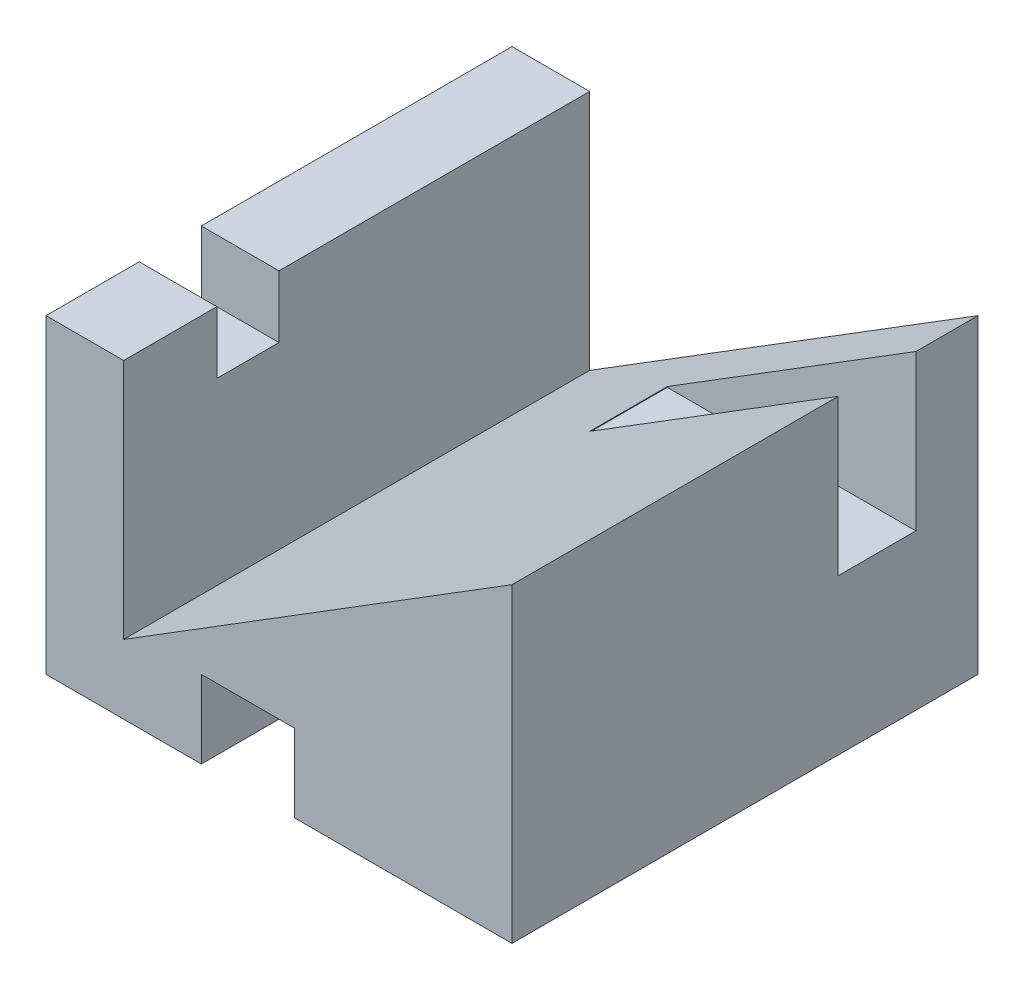
ISO-10303-21;
HEADER;
FILE_DESCRIPTION(('STEP AP214'),'2;1');
FILE_NAME('part.step','',(''),(''),'','','');
FILE_SCHEMA(('AUTOMOTIVE_DESIGN { 1 0 10303 214 1 1 1 1 }'));
ENDSEC;
DATA;
#1=APPLICATION_CONTEXT('core data for automotive mechanical design processes');
#2=APPLICATION_PROTOCOL_DEFINITION('international standard','automotive_design',2000,#1);
#3=PRODUCT_CONTEXT('',#1,'mechanical');
#4=PRODUCT('Part','Part','',(#3));
#5=PRODUCT_RELATED_PRODUCT_CATEGORY('part','',(#4));
#6=PRODUCT_DEFINITION_FORMATION('','',#4);
#7=PRODUCT_DEFINITION_CONTEXT('part definition',#1,'design');
#8=PRODUCT_DEFINITION('design','',#6,#7);
#9=PRODUCT_DEFINITION_SHAPE('','',#8);
#10=(LENGTH_UNIT() NAMED_UNIT(*) SI_UNIT(.MILLI.,.METRE.));
#11=(NAMED_UNIT(*) PLANE_ANGLE_UNIT() SI_UNIT($,.RADIAN.));
#12=(NAMED_UNIT(*) SI_UNIT($,.STERADIAN.) SOLID_ANGLE_UNIT());
#13=UNCERTAINTY_MEASURE_WITH_UNIT(LENGTH_MEASURE(1.E-05),#10,'distance_accuracy_value','');
#14=(GEOMETRIC_REPRESENTATION_CONTEXT(3) GLOBAL_UNCERTAINTY_ASSIGNED_CONTEXT((#13)) GLOBAL_UNIT_ASSIGNED_CONTEXT((#10,
#11,#12)) REPRESENTATION_CONTEXT('',''));
#15=CARTESIAN_POINT('',(0.,0.,0.));
#16=DIRECTION('',(0.,0.,1.));
#17=DIRECTION('',(1.,0.,0.));
#18=AXIS2_PLACEMENT_3D('',#15,#16,#17);
#19=CARTESIAN_POINT('',(-15.,10.,30.));
#20=DIRECTION('',(0.,-1.,0.));
#21=DIRECTION('',(0.,0.,-1.));
#22=AXIS2_PLACEMENT_3D('',#19,#20,#21);
#23=PLANE('',#22);
#24=DIRECTION('',(0.,0.,-1.));
#25=VECTOR('',#24,1.);
#26=CARTESIAN_POINT('',(-15.,10.,30.));
#27=LINE('',#26,#25);
#28=CARTESIAN_POINT('',(-15.,10.,20.));
#29=VERTEX_POINT('',#28);
#30=CARTESIAN_POINT('',(-15.,10.,0.));
#31=VERTEX_POINT('',#30);
#32=EDGE_CURVE('E278',#29,#31,#27,.T.);
#33=ORIENTED_EDGE('',*,*,#32,.F.);
#34=DIRECTION('',(-1.,0.,0.));
#35=VECTOR('',#34,1.);
#36=CARTESIAN_POINT('',(-15.,10.,20.));
#37=LINE('',#36,#35);
#38=CARTESIAN_POINT('',(-10.,10.,20.));
#39=VERTEX_POINT('',#38);
#40=EDGE_CURVE('E186',#39,#29,#37,.T.);
#41=ORIENTED_EDGE('',*,*,#40,.F.);
#42=DIRECTION('',(0.,0.,1.));
#43=VECTOR('',#42,1.);
#44=CARTESIAN_POINT('',(-10.,10.,0.));
#45=LINE('',#44,#43);
#46=CARTESIAN_POINT('',(-10.,10.,0.));
#47=VERTEX_POINT('',#46);
#48=EDGE_CURVE('E222',#47,#39,#45,.T.);
#49=ORIENTED_EDGE('',*,*,#48,.F.);
#50=DIRECTION('',(-1.,0.,0.));
#51=VECTOR('',#50,1.);
#52=CARTESIAN_POINT('',(-15.,10.,0.));
#53=LINE('',#52,#51);
#54=EDGE_CURVE('E265',#47,#31,#53,.T.);
#55=ORIENTED_EDGE('',*,*,#54,.T.);
#56=EDGE_LOOP('',(#33,#41,#49,#55));
#57=FACE_BOUND('',#56,.T.);
#58=ADVANCED_FACE('F33',(#57),#23,.F.);
#59=CARTESIAN_POINT('',(-15.,-10.,30.));
#60=DIRECTION('',(0.,1.,0.));
#61=DIRECTION('',(0.,0.,1.));
#62=AXIS2_PLACEMENT_3D('',#59,#60,#61);
#63=PLANE('',#62);
#64=DIRECTION('',(1.,0.,0.));
#65=VECTOR('',#64,1.);
#66=CARTESIAN_POINT('',(-15.,-10.,0.));
#67=LINE('',#66,#65);
#68=CARTESIAN_POINT('',(-15.,-10.,0.));
#69=VERTEX_POINT('',#68);
#70=CARTESIAN_POINT('',(-5.,-10.,0.));
#71=VERTEX_POINT('',#70);
#72=EDGE_CURVE('E255',#69,#71,#67,.T.);
#73=ORIENTED_EDGE('',*,*,#72,.T.);
#74=DIRECTION('',(0.,0.,1.));
#75=VECTOR('',#74,1.);
#76=CARTESIAN_POINT('',(-5.,-10.,0.));
#77=LINE('',#76,#75);
#78=CARTESIAN_POINT('',(-5.,-10.,30.));
#79=VERTEX_POINT('',#78);
#80=EDGE_CURVE('E235',#71,#79,#77,.T.);
#81=ORIENTED_EDGE('',*,*,#80,.T.);
#82=DIRECTION('',(1.,0.,0.));
#83=VECTOR('',#82,1.);
#84=CARTESIAN_POINT('',(-15.,-10.,30.));
#85=LINE('',#84,#83);
#86=CARTESIAN_POINT('',(-15.,-10.,30.));
#87=VERTEX_POINT('',#86);
#88=EDGE_CURVE('E260',#87,#79,#85,.T.);
#89=ORIENTED_EDGE('',*,*,#88,.F.);
#90=DIRECTION('',(0.,0.,-1.));
#91=VECTOR('',#90,1.);
#92=CARTESIAN_POINT('',(-15.,-10.,30.));
#93=LINE('',#92,#91);
#94=EDGE_CURVE('E275',#87,#69,#93,.T.);
#95=ORIENTED_EDGE('',*,*,#94,.T.);
#96=EDGE_LOOP('',(#73,#81,#89,#95));
#97=FACE_BOUND('',#96,.T.);
#98=ADVANCED_FACE('F331',(#97),#63,.F.);
#99=CARTESIAN_POINT('',(15.,10.,30.));
#100=DIRECTION('',(-1.,0.,0.));
#101=DIRECTION('',(0.,-1.,0.));
#102=AXIS2_PLACEMENT_3D('',#99,#100,#101);
#103=PLANE('',#102);
#104=DIRECTION('',(0.,0.,-1.));
#105=VECTOR('',#104,1.);
#106=CARTESIAN_POINT('',(15.,0.,4.));
#107=LINE('',#106,#105);
#108=CARTESIAN_POINT('',(15.,0.,9.));
#109=VERTEX_POINT('',#108);
#110=CARTESIAN_POINT('',(15.,0.,4.));
#111=VERTEX_POINT('',#110);
#112=EDGE_CURVE('E165',#109,#111,#107,.T.);
#113=ORIENTED_EDGE('',*,*,#112,.F.);
#114=DIRECTION('',(0.,1.,0.));
#115=VECTOR('',#114,1.);
#116=CARTESIAN_POINT('',(15.,0.,9.));
#117=LINE('',#116,#115);
#118=CARTESIAN_POINT('',(15.,10.,9.));
#119=VERTEX_POINT('',#118);
#120=EDGE_CURVE('E196',#109,#119,#117,.T.);
#121=ORIENTED_EDGE('',*,*,#120,.T.);
#122=DIRECTION('',(0.,0.,-1.));
#123=VECTOR('',#122,1.);
#124=CARTESIAN_POINT('',(15.,10.,30.));
#125=LINE('',#124,#123);
#126=CARTESIAN_POINT('',(15.,10.,30.));
#127=VERTEX_POINT('',#126);
#128=EDGE_CURVE('E282',#127,#119,#125,.T.);
#129=ORIENTED_EDGE('',*,*,#128,.F.);
#130=DIRECTION('',(0.,1.,0.));
#131=VECTOR('',#130,1.);
#132=CARTESIAN_POINT('',(15.,10.,30.));
#133=LINE('',#132,#131);
#134=CARTESIAN_POINT('',(15.,-10.,30.));
#135=VERTEX_POINT('',#134);
#136=EDGE_CURVE('E251',#135,#127,#133,.T.);
#137=ORIENTED_EDGE('',*,*,#136,.F.);
#138=DIRECTION('',(0.,0.,-1.));
#139=VECTOR('',#138,1.);
#140=CARTESIAN_POINT('',(15.,-10.,30.));
#141=LINE('',#140,#139);
#142=CARTESIAN_POINT('',(15.,-10.,0.));
#143=VERTEX_POINT('',#142);
#144=EDGE_CURVE('E263',#135,#143,#141,.T.);
#145=ORIENTED_EDGE('',*,*,#144,.T.);
#146=DIRECTION('',(0.,1.,0.));
#147=VECTOR('',#146,1.);
#148=CARTESIAN_POINT('',(15.,10.,0.));
#149=LINE('',#148,#147);
#150=CARTESIAN_POINT('',(15.,10.,0.));
#151=VERTEX_POINT('',#150);
#152=EDGE_CURVE('E244',#143,#151,#149,.T.);
#153=ORIENTED_EDGE('',*,*,#152,.T.);
#154=CARTESIAN_POINT('',(15.,10.,4.));
#155=VERTEX_POINT('',#154);
#156=EDGE_CURVE('E177',#155,#151,#125,.T.);
#157=ORIENTED_EDGE('',*,*,#156,.F.);
#158=DIRECTION('',(0.,1.,0.));
#159=VECTOR('',#158,1.);
#160=CARTESIAN_POINT('',(15.,0.,4.));
#161=LINE('',#160,#159);
#162=EDGE_CURVE('E48',#111,#155,#161,.T.);
#163=ORIENTED_EDGE('',*,*,#162,.F.);
#164=EDGE_LOOP('',(#113,#121,#129,#137,#145,#153,#157,#163));
#165=FACE_BOUND('',#164,.T.);
#166=ADVANCED_FACE('F35',(#165),#103,.F.);
#167=CARTESIAN_POINT('',(-10.,10.,24.));
#168=VERTEX_POINT('',#167);
#169=CARTESIAN_POINT('',(-10.,10.,30.));
#170=VERTEX_POINT('',#169);
#171=EDGE_CURVE('E215',#168,#170,#45,.T.);
#172=ORIENTED_EDGE('',*,*,#171,.F.);
#173=DIRECTION('',(1.,0.,0.));
#174=VECTOR('',#173,1.);
#175=CARTESIAN_POINT('',(-15.,10.,24.));
#176=LINE('',#175,#174);
#177=CARTESIAN_POINT('',(-15.,10.,24.));
#178=VERTEX_POINT('',#177);
#179=EDGE_CURVE('E194',#178,#168,#176,.T.);
#180=ORIENTED_EDGE('',*,*,#179,.F.);
#181=CARTESIAN_POINT('',(-15.,10.,30.));
#182=VERTEX_POINT('',#181);
#183=EDGE_CURVE('E279',#182,#178,#27,.T.);
#184=ORIENTED_EDGE('',*,*,#183,.F.);
#185=DIRECTION('',(-1.,0.,0.));
#186=VECTOR('',#185,1.);
#187=CARTESIAN_POINT('',(-15.,10.,30.));
#188=LINE('',#187,#186);
#189=EDGE_CURVE('E254',#170,#182,#188,.T.);
#190=ORIENTED_EDGE('',*,*,#189,.F.);
#191=EDGE_LOOP('',(#172,#180,#184,#190));
#192=FACE_BOUND('',#191,.T.);
#193=ADVANCED_FACE('F319',(#192),#23,.F.);
#194=CARTESIAN_POINT('',(-15.,10.,30.));
#195=DIRECTION('',(1.,0.,0.));
#196=DIRECTION('',(0.,1.,0.));
#197=AXIS2_PLACEMENT_3D('',#194,#195,#196);
#198=PLANE('',#197);
#199=DIRECTION('',(0.,0.,1.));
#200=VECTOR('',#199,1.);
#201=CARTESIAN_POINT('',(-15.,6.00000000000002,20.));
#202=LINE('',#201,#200);
#203=CARTESIAN_POINT('',(-15.,6.00000000000002,20.));
#204=VERTEX_POINT('',#203);
#205=CARTESIAN_POINT('',(-15.,6.00000000000002,24.));
#206=VERTEX_POINT('',#205);
#207=EDGE_CURVE('E184',#204,#206,#202,.T.);
#208=ORIENTED_EDGE('',*,*,#207,.F.);
#209=DIRECTION('',(0.,1.,0.));
#210=VECTOR('',#209,1.);
#211=CARTESIAN_POINT('',(-15.,6.00000000000002,20.));
#212=LINE('',#211,#210);
#213=EDGE_CURVE('E198',#204,#29,#212,.T.);
#214=ORIENTED_EDGE('',*,*,#213,.T.);
#215=ORIENTED_EDGE('',*,*,#32,.T.);
#216=DIRECTION('',(0.,-1.,0.));
#217=VECTOR('',#216,1.);
#218=CARTESIAN_POINT('',(-15.,10.,0.));
#219=LINE('',#218,#217);
#220=EDGE_CURVE('E268',#31,#69,#219,.T.);
#221=ORIENTED_EDGE('',*,*,#220,.T.);
#222=ORIENTED_EDGE('',*,*,#94,.F.);
#223=DIRECTION('',(0.,-1.,0.));
#224=VECTOR('',#223,1.);
#225=CARTESIAN_POINT('',(-15.,10.,30.));
#226=LINE('',#225,#224);
#227=EDGE_CURVE('E257',#182,#87,#226,.T.);
#228=ORIENTED_EDGE('',*,*,#227,.F.);
#229=ORIENTED_EDGE('',*,*,#183,.T.);
#230=DIRECTION('',(0.,1.,0.));
#231=VECTOR('',#230,1.);
#232=CARTESIAN_POINT('',(-15.,6.00000000000002,24.));
#233=LINE('',#232,#231);
#234=EDGE_CURVE('E193',#206,#178,#233,.T.);
#235=ORIENTED_EDGE('',*,*,#234,.F.);
#236=EDGE_LOOP('',(#208,#214,#215,#221,#222,#228,#229,#235));
#237=FACE_BOUND('',#236,.T.);
#238=ADVANCED_FACE('F326',(#237),#198,.F.);
#239=CARTESIAN_POINT('',(0.999999999999997,-10.,30.));
#240=VERTEX_POINT('',#239);
#241=EDGE_CURVE('E259',#240,#135,#85,.T.);
#242=ORIENTED_EDGE('',*,*,#241,.F.);
#243=DIRECTION('',(0.,0.,1.));
#244=VECTOR('',#243,1.);
#245=CARTESIAN_POINT('',(0.999999999999997,-10.,0.));
#246=LINE('',#245,#244);
#247=CARTESIAN_POINT('',(0.999999999999997,-10.,0.));
#248=VERTEX_POINT('',#247);
#249=EDGE_CURVE('E247',#248,#240,#246,.T.);
#250=ORIENTED_EDGE('',*,*,#249,.F.);
#251=EDGE_CURVE('E270',#248,#143,#67,.T.);
#252=ORIENTED_EDGE('',*,*,#251,.T.);
#253=ORIENTED_EDGE('',*,*,#144,.F.);
#254=EDGE_LOOP('',(#242,#250,#252,#253));
#255=FACE_BOUND('',#254,.T.);
#256=ADVANCED_FACE('F343',(#255),#63,.F.);
#257=CARTESIAN_POINT('',(0.,0.,30.));
#258=DIRECTION('',(0.,0.,1.));
#259=DIRECTION('',(1.,0.,0.));
#260=AXIS2_PLACEMENT_3D('',#257,#258,#259);
#261=PLANE('',#260);
#262=DIRECTION('',(0.849123028037868,0.52819511854598,0.));
#263=VECTOR('',#262,1.);
#264=CARTESIAN_POINT('',(-10.,-5.55119520685121,30.));
#265=LINE('',#264,#263);
#266=CARTESIAN_POINT('',(-10.,-5.55119520685121,30.));
#267=VERTEX_POINT('',#266);
#268=EDGE_CURVE('E212',#267,#127,#265,.T.);
#269=ORIENTED_EDGE('',*,*,#268,.F.);
#270=DIRECTION('',(0.,-1.,0.));
#271=VECTOR('',#270,1.);
#272=CARTESIAN_POINT('',(-10.,10.,30.));
#273=LINE('',#272,#271);
#274=EDGE_CURVE('E201',#170,#267,#273,.T.);
#275=ORIENTED_EDGE('',*,*,#274,.F.);
#276=ORIENTED_EDGE('',*,*,#189,.T.);
#277=ORIENTED_EDGE('',*,*,#227,.T.);
#278=ORIENTED_EDGE('',*,*,#88,.T.);
#279=DIRECTION('',(0.,-1.,0.));
#280=VECTOR('',#279,1.);
#281=CARTESIAN_POINT('',(-5.,-10.,30.));
#282=LINE('',#281,#280);
#283=CARTESIAN_POINT('',(-5.,-5.,30.));
#284=VERTEX_POINT('',#283);
#285=EDGE_CURVE('E221',#284,#79,#282,.T.);
#286=ORIENTED_EDGE('',*,*,#285,.F.);
#287=DIRECTION('',(-1.,0.,0.));
#288=VECTOR('',#287,1.);
#289=CARTESIAN_POINT('',(-5.,-5.,30.));
#290=LINE('',#289,#288);
#291=CARTESIAN_POINT('',(0.999999999999997,-5.,30.));
#292=VERTEX_POINT('',#291);
#293=EDGE_CURVE('E229',#292,#284,#290,.T.);
#294=ORIENTED_EDGE('',*,*,#293,.F.);
#295=DIRECTION('',(0.,1.,0.));
#296=VECTOR('',#295,1.);
#297=CARTESIAN_POINT('',(0.999999999999997,-10.,30.));
#298=LINE('',#297,#296);
#299=EDGE_CURVE('E237',#240,#292,#298,.T.);
#300=ORIENTED_EDGE('',*,*,#299,.F.);
#301=ORIENTED_EDGE('',*,*,#241,.T.);
#302=ORIENTED_EDGE('',*,*,#136,.T.);
#303=EDGE_LOOP('',(#269,#275,#276,#277,#278,#286,#294,#300,#301,#302));
#304=FACE_BOUND('',#303,.T.);
#305=ADVANCED_FACE('F302',(#304),#261,.T.);
#306=CARTESIAN_POINT('',(0.,0.,0.));
#307=DIRECTION('',(0.,0.,1.));
#308=DIRECTION('',(1.,0.,0.));
#309=AXIS2_PLACEMENT_3D('',#306,#307,#308);
#310=PLANE('',#309);
#311=DIRECTION('',(0.,-1.,0.));
#312=VECTOR('',#311,1.);
#313=CARTESIAN_POINT('',(-10.,10.,0.));
#314=LINE('',#313,#312);
#315=CARTESIAN_POINT('',(-10.,-5.55119520685121,0.));
#316=VERTEX_POINT('',#315);
#317=EDGE_CURVE('E208',#47,#316,#314,.T.);
#318=ORIENTED_EDGE('',*,*,#317,.T.);
#319=DIRECTION('',(0.849123028037868,0.52819511854598,0.));
#320=VECTOR('',#319,1.);
#321=CARTESIAN_POINT('',(-10.,-5.55119520685121,0.));
#322=LINE('',#321,#320);
#323=EDGE_CURVE('E211',#316,#151,#322,.T.);
#324=ORIENTED_EDGE('',*,*,#323,.T.);
#325=ORIENTED_EDGE('',*,*,#152,.F.);
#326=ORIENTED_EDGE('',*,*,#251,.F.);
#327=DIRECTION('',(0.,1.,0.));
#328=VECTOR('',#327,1.);
#329=CARTESIAN_POINT('',(0.999999999999997,-10.,0.));
#330=LINE('',#329,#328);
#331=CARTESIAN_POINT('',(0.999999999999997,-5.,0.));
#332=VERTEX_POINT('',#331);
#333=EDGE_CURVE('E228',#248,#332,#330,.T.);
#334=ORIENTED_EDGE('',*,*,#333,.T.);
#335=DIRECTION('',(-1.,0.,0.));
#336=VECTOR('',#335,1.);
#337=CARTESIAN_POINT('',(-5.,-5.,0.));
#338=LINE('',#337,#336);
#339=CARTESIAN_POINT('',(-5.,-5.,0.));
#340=VERTEX_POINT('',#339);
#341=EDGE_CURVE('E232',#332,#340,#338,.T.);
#342=ORIENTED_EDGE('',*,*,#341,.T.);
#343=DIRECTION('',(0.,-1.,0.));
#344=VECTOR('',#343,1.);
#345=CARTESIAN_POINT('',(-5.,-10.,0.));
#346=LINE('',#345,#344);
#347=EDGE_CURVE('E225',#340,#71,#346,.T.);
#348=ORIENTED_EDGE('',*,*,#347,.T.);
#349=ORIENTED_EDGE('',*,*,#72,.F.);
#350=ORIENTED_EDGE('',*,*,#220,.F.);
#351=ORIENTED_EDGE('',*,*,#54,.F.);
#352=EDGE_LOOP('',(#318,#324,#325,#326,#334,#342,#348,#349,#350,#351));
#353=FACE_BOUND('',#352,.T.);
#354=ADVANCED_FACE('F310',(#353),#310,.F.);
#355=CARTESIAN_POINT('',(-5.,-10.,0.));
#356=DIRECTION('',(-1.,0.,0.));
#357=DIRECTION('',(0.,0.,1.));
#358=AXIS2_PLACEMENT_3D('',#355,#356,#357);
#359=PLANE('',#358);
#360=ORIENTED_EDGE('',*,*,#285,.T.);
#361=ORIENTED_EDGE('',*,*,#80,.F.);
#362=ORIENTED_EDGE('',*,*,#347,.F.);
#363=DIRECTION('',(0.,0.,1.));
#364=VECTOR('',#363,1.);
#365=CARTESIAN_POINT('',(-5.,-5.,0.));
#366=LINE('',#365,#364);
#367=EDGE_CURVE('E242',#340,#284,#366,.T.);
#368=ORIENTED_EDGE('',*,*,#367,.T.);
#369=EDGE_LOOP('',(#360,#361,#362,#368));
#370=FACE_BOUND('',#369,.T.);
#371=ADVANCED_FACE('F335',(#370),#359,.F.);
#372=CARTESIAN_POINT('',(-5.,-5.,0.));
#373=DIRECTION('',(0.,1.,0.));
#374=DIRECTION('',(0.,0.,1.));
#375=AXIS2_PLACEMENT_3D('',#372,#373,#374);
#376=PLANE('',#375);
#377=ORIENTED_EDGE('',*,*,#293,.T.);
#378=ORIENTED_EDGE('',*,*,#367,.F.);
#379=ORIENTED_EDGE('',*,*,#341,.F.);
#380=DIRECTION('',(0.,0.,1.));
#381=VECTOR('',#380,1.);
#382=CARTESIAN_POINT('',(0.999999999999997,-5.,0.));
#383=LINE('',#382,#381);
#384=EDGE_CURVE('E245',#332,#292,#383,.T.);
#385=ORIENTED_EDGE('',*,*,#384,.T.);
#386=EDGE_LOOP('',(#377,#378,#379,#385));
#387=FACE_BOUND('',#386,.T.);
#388=ADVANCED_FACE('F339',(#387),#376,.F.);
#389=CARTESIAN_POINT('',(0.999999999999997,-10.,0.));
#390=DIRECTION('',(1.,0.,0.));
#391=DIRECTION('',(0.,0.,-1.));
#392=AXIS2_PLACEMENT_3D('',#389,#390,#391);
#393=PLANE('',#392);
#394=ORIENTED_EDGE('',*,*,#299,.T.);
#395=ORIENTED_EDGE('',*,*,#384,.F.);
#396=ORIENTED_EDGE('',*,*,#333,.F.);
#397=ORIENTED_EDGE('',*,*,#249,.T.);
#398=EDGE_LOOP('',(#394,#395,#396,#397));
#399=FACE_BOUND('',#398,.T.);
#400=ADVANCED_FACE('F341',(#399),#393,.F.);
#401=CARTESIAN_POINT('',(-10.,-5.55119520685121,0.));
#402=DIRECTION('',(0.52819511854598,-0.849123028037868,0.));
#403=DIRECTION('',(0.849123028037868,0.52819511854598,0.));
#404=AXIS2_PLACEMENT_3D('',#401,#402,#403);
#405=PLANE('',#404);
#406=ORIENTED_EDGE('',*,*,#128,.T.);
#407=DIRECTION('',(-0.849123028037868,-0.52819511854598,0.));
#408=VECTOR('',#407,1.);
#409=CARTESIAN_POINT('',(-10.,-5.55119520685121,9.));
#410=LINE('',#409,#408);
#411=CARTESIAN_POINT('',(-1.,0.0472350676152233,9.));
#412=VERTEX_POINT('',#411);
#413=EDGE_CURVE('E11',#119,#412,#410,.T.);
#414=ORIENTED_EDGE('',*,*,#413,.T.);
#415=DIRECTION('',(0.,0.,-1.));
#416=VECTOR('',#415,1.);
#417=CARTESIAN_POINT('',(-1.,0.047235067615223,0.));
#418=LINE('',#417,#416);
#419=CARTESIAN_POINT('',(-1.,0.0472350676152238,4.));
#420=VERTEX_POINT('',#419);
#421=EDGE_CURVE('E41',#412,#420,#418,.T.);
#422=ORIENTED_EDGE('',*,*,#421,.T.);
#423=DIRECTION('',(0.849123028037868,0.52819511854598,0.));
#424=VECTOR('',#423,1.);
#425=CARTESIAN_POINT('',(-10.,-5.55119520685121,4.));
#426=LINE('',#425,#424);
#427=EDGE_CURVE('E285',#420,#155,#426,.T.);
#428=ORIENTED_EDGE('',*,*,#427,.T.);
#429=ORIENTED_EDGE('',*,*,#156,.T.);
#430=ORIENTED_EDGE('',*,*,#323,.F.);
#431=DIRECTION('',(0.,0.,1.));
#432=VECTOR('',#431,1.);
#433=CARTESIAN_POINT('',(-10.,-5.55119520685121,0.));
#434=LINE('',#433,#432);
#435=EDGE_CURVE('E219',#316,#267,#434,.T.);
#436=ORIENTED_EDGE('',*,*,#435,.T.);
#437=ORIENTED_EDGE('',*,*,#268,.T.);
#438=EDGE_LOOP('',(#406,#414,#422,#428,#429,#430,#436,#437));
#439=FACE_BOUND('',#438,.T.);
#440=ADVANCED_FACE('F288',(#439),#405,.F.);
#441=CARTESIAN_POINT('',(-10.,10.,0.));
#442=DIRECTION('',(-1.,0.,0.));
#443=DIRECTION('',(0.,-1.,0.));
#444=AXIS2_PLACEMENT_3D('',#441,#442,#443);
#445=PLANE('',#444);
#446=ORIENTED_EDGE('',*,*,#48,.T.);
#447=DIRECTION('',(0.,1.,0.));
#448=VECTOR('',#447,1.);
#449=CARTESIAN_POINT('',(-10.,6.00000000000002,20.));
#450=LINE('',#449,#448);
#451=CARTESIAN_POINT('',(-10.,6.00000000000002,20.));
#452=VERTEX_POINT('',#451);
#453=EDGE_CURVE('E202',#452,#39,#450,.T.);
#454=ORIENTED_EDGE('',*,*,#453,.F.);
#455=DIRECTION('',(0.,0.,-1.));
#456=VECTOR('',#455,1.);
#457=CARTESIAN_POINT('',(-10.,6.00000000000002,20.));
#458=LINE('',#457,#456);
#459=CARTESIAN_POINT('',(-10.,6.00000000000002,24.));
#460=VERTEX_POINT('',#459);
#461=EDGE_CURVE('E188',#460,#452,#458,.T.);
#462=ORIENTED_EDGE('',*,*,#461,.F.);
#463=DIRECTION('',(0.,1.,0.));
#464=VECTOR('',#463,1.);
#465=CARTESIAN_POINT('',(-10.,6.00000000000002,24.));
#466=LINE('',#465,#464);
#467=EDGE_CURVE('E204',#460,#168,#466,.T.);
#468=ORIENTED_EDGE('',*,*,#467,.T.);
#469=ORIENTED_EDGE('',*,*,#171,.T.);
#470=ORIENTED_EDGE('',*,*,#274,.T.);
#471=ORIENTED_EDGE('',*,*,#435,.F.);
#472=ORIENTED_EDGE('',*,*,#317,.F.);
#473=EDGE_LOOP('',(#446,#454,#462,#468,#469,#470,#471,#472));
#474=FACE_BOUND('',#473,.T.);
#475=ADVANCED_FACE('F313',(#474),#445,.F.);
#476=CARTESIAN_POINT('',(-15.,6.00000000000002,20.));
#477=DIRECTION('',(0.,0.,-1.));
#478=DIRECTION('',(-1.,0.,0.));
#479=AXIS2_PLACEMENT_3D('',#476,#477,#478);
#480=PLANE('',#479);
#481=ORIENTED_EDGE('',*,*,#40,.T.);
#482=ORIENTED_EDGE('',*,*,#213,.F.);
#483=DIRECTION('',(-1.,0.,0.));
#484=VECTOR('',#483,1.);
#485=CARTESIAN_POINT('',(-15.,6.00000000000002,20.));
#486=LINE('',#485,#484);
#487=EDGE_CURVE('E190',#452,#204,#486,.T.);
#488=ORIENTED_EDGE('',*,*,#487,.F.);
#489=ORIENTED_EDGE('',*,*,#453,.T.);
#490=EDGE_LOOP('',(#481,#482,#488,#489));
#491=FACE_BOUND('',#490,.T.);
#492=ADVANCED_FACE('F438',(#491),#480,.F.);
#493=CARTESIAN_POINT('',(-15.,6.00000000000002,24.));
#494=DIRECTION('',(0.,0.,1.));
#495=DIRECTION('',(1.,0.,0.));
#496=AXIS2_PLACEMENT_3D('',#493,#494,#495);
#497=PLANE('',#496);
#498=ORIENTED_EDGE('',*,*,#179,.T.);
#499=ORIENTED_EDGE('',*,*,#467,.F.);
#500=DIRECTION('',(1.,0.,0.));
#501=VECTOR('',#500,1.);
#502=CARTESIAN_POINT('',(-15.,6.00000000000002,24.));
#503=LINE('',#502,#501);
#504=EDGE_CURVE('E56',#206,#460,#503,.T.);
#505=ORIENTED_EDGE('',*,*,#504,.F.);
#506=ORIENTED_EDGE('',*,*,#234,.T.);
#507=EDGE_LOOP('',(#498,#499,#505,#506));
#508=FACE_BOUND('',#507,.T.);
#509=ADVANCED_FACE('F446',(#508),#497,.F.);
#510=CARTESIAN_POINT('',(0.,6.00000000000002,0.));
#511=DIRECTION('',(0.,1.,0.));
#512=DIRECTION('',(0.,0.,1.));
#513=AXIS2_PLACEMENT_3D('',#510,#511,#512);
#514=PLANE('',#513);
#515=ORIENTED_EDGE('',*,*,#207,.T.);
#516=ORIENTED_EDGE('',*,*,#504,.T.);
#517=ORIENTED_EDGE('',*,*,#461,.T.);
#518=ORIENTED_EDGE('',*,*,#487,.T.);
#519=EDGE_LOOP('',(#515,#516,#517,#518));
#520=FACE_BOUND('',#519,.T.);
#521=ADVANCED_FACE('F455',(#520),#514,.T.);
#522=CARTESIAN_POINT('',(15.,0.,9.));
#523=DIRECTION('',(0.,0.,1.));
#524=DIRECTION('',(1.,0.,0.));
#525=AXIS2_PLACEMENT_3D('',#522,#523,#524);
#526=PLANE('',#525);
#527=ORIENTED_EDGE('',*,*,#120,.F.);
#528=DIRECTION('',(1.,0.,0.));
#529=VECTOR('',#528,1.);
#530=CARTESIAN_POINT('',(15.,0.,9.));
#531=LINE('',#530,#529);
#532=CARTESIAN_POINT('',(-1.,0.,9.));
#533=VERTEX_POINT('',#532);
#534=EDGE_CURVE('E171',#533,#109,#531,.T.);
#535=ORIENTED_EDGE('',*,*,#534,.F.);
#536=DIRECTION('',(0.,1.,0.));
#537=VECTOR('',#536,1.);
#538=CARTESIAN_POINT('',(-1.,0.,9.));
#539=LINE('',#538,#537);
#540=EDGE_CURVE('E179',#533,#412,#539,.T.);
#541=ORIENTED_EDGE('',*,*,#540,.T.);
#542=ORIENTED_EDGE('',*,*,#413,.F.);
#543=EDGE_LOOP('',(#527,#535,#541,#542));
#544=FACE_BOUND('',#543,.T.);
#545=ADVANCED_FACE('F293',(#544),#526,.F.);
#546=CARTESIAN_POINT('',(-1.,0.,4.));
#547=DIRECTION('',(-1.,0.,0.));
#548=DIRECTION('',(0.,0.,1.));
#549=AXIS2_PLACEMENT_3D('',#546,#547,#548);
#550=PLANE('',#549);
#551=ORIENTED_EDGE('',*,*,#540,.F.);
#552=DIRECTION('',(0.,0.,1.));
#553=VECTOR('',#552,1.);
#554=CARTESIAN_POINT('',(-1.,0.,4.));
#555=LINE('',#554,#553);
#556=CARTESIAN_POINT('',(-1.,0.,4.));
#557=VERTEX_POINT('',#556);
#558=EDGE_CURVE('E164',#557,#533,#555,.T.);
#559=ORIENTED_EDGE('',*,*,#558,.F.);
#560=DIRECTION('',(0.,1.,0.));
#561=VECTOR('',#560,1.);
#562=CARTESIAN_POINT('',(-1.,0.,4.));
#563=LINE('',#562,#561);
#564=EDGE_CURVE('E160',#557,#420,#563,.T.);
#565=ORIENTED_EDGE('',*,*,#564,.T.);
#566=ORIENTED_EDGE('',*,*,#421,.F.);
#567=EDGE_LOOP('',(#551,#559,#565,#566));
#568=FACE_BOUND('',#567,.T.);
#569=ADVANCED_FACE('F291',(#568),#550,.F.);
#570=CARTESIAN_POINT('',(15.,0.,4.));
#571=DIRECTION('',(0.,0.,-1.));
#572=DIRECTION('',(-1.,0.,0.));
#573=AXIS2_PLACEMENT_3D('',#570,#571,#572);
#574=PLANE('',#573);
#575=ORIENTED_EDGE('',*,*,#564,.F.);
#576=DIRECTION('',(-1.,0.,0.));
#577=VECTOR('',#576,1.);
#578=CARTESIAN_POINT('',(15.,0.,4.));
#579=LINE('',#578,#577);
#580=EDGE_CURVE('E156',#111,#557,#579,.T.);
#581=ORIENTED_EDGE('',*,*,#580,.F.);
#582=ORIENTED_EDGE('',*,*,#162,.T.);
#583=ORIENTED_EDGE('',*,*,#427,.F.);
#584=EDGE_LOOP('',(#575,#581,#582,#583));
#585=FACE_BOUND('',#584,.T.);
#586=ADVANCED_FACE('F158',(#585),#574,.F.);
#587=CARTESIAN_POINT('',(0.,0.,0.));
#588=DIRECTION('',(0.,-1.,0.));
#589=DIRECTION('',(0.,0.,-1.));
#590=AXIS2_PLACEMENT_3D('',#587,#588,#589);
#591=PLANE('',#590);
#592=ORIENTED_EDGE('',*,*,#112,.T.);
#593=ORIENTED_EDGE('',*,*,#580,.T.);
#594=ORIENTED_EDGE('',*,*,#558,.T.);
#595=ORIENTED_EDGE('',*,*,#534,.T.);
#596=EDGE_LOOP('',(#592,#593,#594,#595));
#597=FACE_BOUND('',#596,.T.);
#598=ADVANCED_FACE('F169',(#597),#591,.F.);
#599=CLOSED_SHELL('',(#58,#98,#166,#193,#238,#256,#305,#354,#371,#388,#400,#440,#475,#492,#509,
#521,#545,#569,#586,#598));
#600=MANIFOLD_SOLID_BREP('B2',#599);
#601=ADVANCED_BREP_SHAPE_REPRESENTATION('',(#18,#600),#14);
#602=SHAPE_DEFINITION_REPRESENTATION(#9,#601);
ENDSEC;
END-ISO-10303-21;
